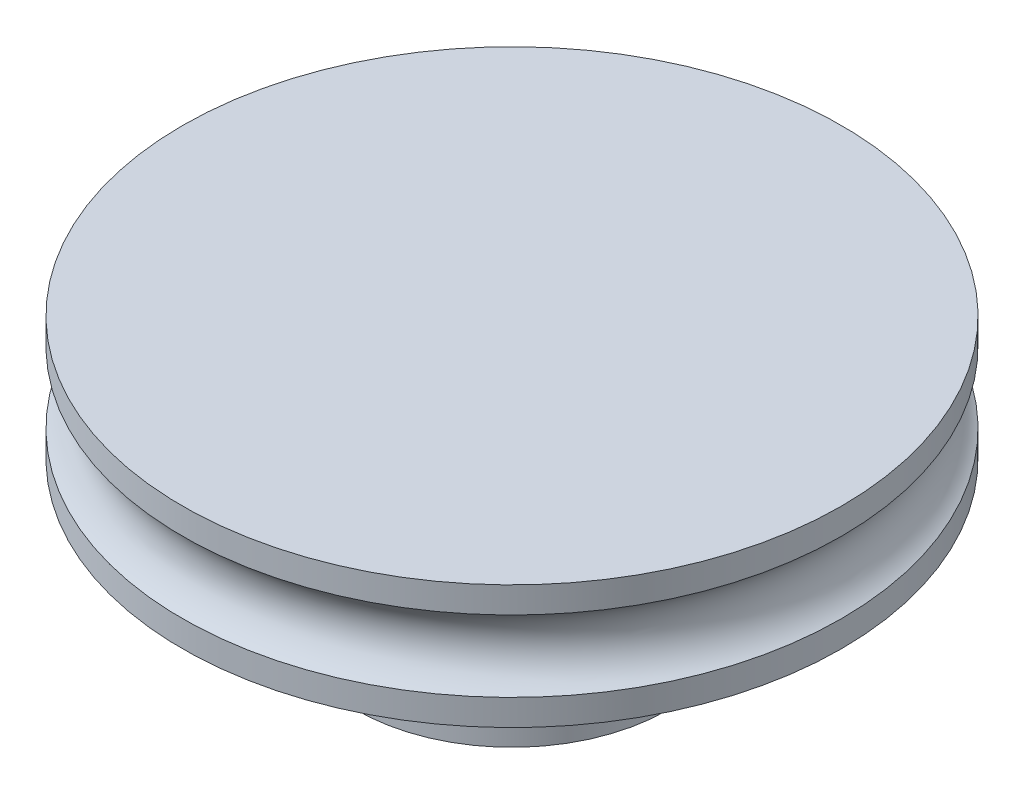
ISO-10303-21;
HEADER;
FILE_DESCRIPTION(('STEP AP214'),'2;1');
FILE_NAME('part.step','',(''),(''),'','','');
FILE_SCHEMA(('AUTOMOTIVE_DESIGN { 1 0 10303 214 1 1 1 1 }'));
ENDSEC;
DATA;
#1=APPLICATION_CONTEXT('core data for automotive mechanical design processes');
#2=APPLICATION_PROTOCOL_DEFINITION('international standard','automotive_design',2000,#1);
#3=PRODUCT_CONTEXT('',#1,'mechanical');
#4=PRODUCT('Part','Part','',(#3));
#5=PRODUCT_RELATED_PRODUCT_CATEGORY('part','',(#4));
#6=PRODUCT_DEFINITION_FORMATION('','',#4);
#7=PRODUCT_DEFINITION_CONTEXT('part definition',#1,'design');
#8=PRODUCT_DEFINITION('design','',#6,#7);
#9=PRODUCT_DEFINITION_SHAPE('','',#8);
#10=(LENGTH_UNIT() NAMED_UNIT(*) SI_UNIT(.MILLI.,.METRE.));
#11=(NAMED_UNIT(*) PLANE_ANGLE_UNIT() SI_UNIT($,.RADIAN.));
#12=(NAMED_UNIT(*) SI_UNIT($,.STERADIAN.) SOLID_ANGLE_UNIT());
#13=UNCERTAINTY_MEASURE_WITH_UNIT(LENGTH_MEASURE(1.E-05),#10,'distance_accuracy_value','');
#14=(GEOMETRIC_REPRESENTATION_CONTEXT(3) GLOBAL_UNCERTAINTY_ASSIGNED_CONTEXT((#13)) GLOBAL_UNIT_ASSIGNED_CONTEXT((#10,
#11,#12)) REPRESENTATION_CONTEXT('',''));
#15=CARTESIAN_POINT('',(0.,0.,0.));
#16=DIRECTION('',(0.,0.,1.));
#17=DIRECTION('',(1.,0.,0.));
#18=AXIS2_PLACEMENT_3D('',#15,#16,#17);
#19=CARTESIAN_POINT('',(0.,2.38125,0.));
#20=DIRECTION('',(0.,1.,0.));
#21=DIRECTION('',(-1.,0.,0.));
#22=AXIS2_PLACEMENT_3D('',#19,#20,#21);
#23=PLANE('',#22);
#24=CARTESIAN_POINT('',(0.,2.38125,0.));
#25=DIRECTION('',(0.,-1.,0.));
#26=DIRECTION('',(1.,0.,0.));
#27=AXIS2_PLACEMENT_3D('',#24,#25,#26);
#28=CIRCLE('',#27,12.7);
#29=CARTESIAN_POINT('',(12.7,2.38125,0.));
#30=VERTEX_POINT('',#29);
#31=EDGE_CURVE('E44',#30,#30,#28,.T.);
#32=ORIENTED_EDGE('',*,*,#31,.F.);
#33=EDGE_LOOP('',(#32));
#34=FACE_BOUND('',#33,.T.);
#35=ADVANCED_FACE('F37',(#34),#23,.T.);
#36=CARTESIAN_POINT('',(0.,0.,0.));
#37=DIRECTION('',(0.,-1.,0.));
#38=DIRECTION('',(1.,0.,0.));
#39=AXIS2_PLACEMENT_3D('',#36,#37,#38);
#40=CYLINDRICAL_SURFACE('',#39,12.7);
#41=ORIENTED_EDGE('',*,*,#31,.T.);
#42=EDGE_LOOP('',(#41));
#43=FACE_BOUND('',#42,.T.);
#44=CARTESIAN_POINT('',(0.,1.3748153285078,0.));
#45=DIRECTION('',(0.,-1.,0.));
#46=DIRECTION('',(1.,0.,0.));
#47=AXIS2_PLACEMENT_3D('',#44,#45,#46);
#48=CIRCLE('',#47,12.7);
#49=CARTESIAN_POINT('',(12.7,1.3748153285078,0.));
#50=VERTEX_POINT('',#49);
#51=EDGE_CURVE('E48',#50,#50,#48,.T.);
#52=ORIENTED_EDGE('',*,*,#51,.F.);
#53=EDGE_LOOP('',(#52));
#54=FACE_BOUND('',#53,.T.);
#55=ADVANCED_FACE('F121',(#43,#54),#40,.T.);
#56=CARTESIAN_POINT('',(0.,0.,0.));
#57=DIRECTION('',(0.,-1.,0.));
#58=DIRECTION('',(1.,0.,0.));
#59=AXIS2_PLACEMENT_3D('',#56,#57,#58);
#60=TOROIDAL_SURFACE('',#59,13.49375,1.5875);
#61=ORIENTED_EDGE('',*,*,#51,.T.);
#62=EDGE_LOOP('',(#61));
#63=FACE_BOUND('',#62,.T.);
#64=CARTESIAN_POINT('',(0.,-1.3748153285078,0.));
#65=DIRECTION('',(0.,-1.,0.));
#66=DIRECTION('',(1.,0.,0.));
#67=AXIS2_PLACEMENT_3D('',#64,#65,#66);
#68=CIRCLE('',#67,12.7);
#69=CARTESIAN_POINT('',(12.7,-1.3748153285078,0.));
#70=VERTEX_POINT('',#69);
#71=EDGE_CURVE('E52',#70,#70,#68,.T.);
#72=ORIENTED_EDGE('',*,*,#71,.F.);
#73=EDGE_LOOP('',(#72));
#74=FACE_BOUND('',#73,.T.);
#75=ADVANCED_FACE('F126',(#63,#74),#60,.F.);
#76=CARTESIAN_POINT('',(0.,0.,0.));
#77=DIRECTION('',(0.,-1.,0.));
#78=DIRECTION('',(1.,0.,0.));
#79=AXIS2_PLACEMENT_3D('',#76,#77,#78);
#80=CYLINDRICAL_SURFACE('',#79,12.7);
#81=ORIENTED_EDGE('',*,*,#71,.T.);
#82=EDGE_LOOP('',(#81));
#83=FACE_BOUND('',#82,.T.);
#84=CARTESIAN_POINT('',(0.,-2.38125,0.));
#85=DIRECTION('',(0.,-1.,0.));
#86=DIRECTION('',(1.,0.,0.));
#87=AXIS2_PLACEMENT_3D('',#84,#85,#86);
#88=CIRCLE('',#87,12.7);
#89=CARTESIAN_POINT('',(12.7,-2.38125,0.));
#90=VERTEX_POINT('',#89);
#91=EDGE_CURVE('E57',#90,#90,#88,.T.);
#92=ORIENTED_EDGE('',*,*,#91,.F.);
#93=EDGE_LOOP('',(#92));
#94=FACE_BOUND('',#93,.T.);
#95=ADVANCED_FACE('F131',(#83,#94),#80,.T.);
#96=CARTESIAN_POINT('',(0.,-2.38125,0.));
#97=DIRECTION('',(0.,-1.,0.));
#98=DIRECTION('',(1.,0.,0.));
#99=AXIS2_PLACEMENT_3D('',#96,#97,#98);
#100=PLANE('',#99);
#101=CARTESIAN_POINT('',(0.,-2.38125,0.));
#102=DIRECTION('',(0.,-1.,0.));
#103=DIRECTION('',(1.,0.,0.));
#104=AXIS2_PLACEMENT_3D('',#101,#102,#103);
#105=CIRCLE('',#104,7.1874076642539);
#106=CARTESIAN_POINT('',(7.1874076642539,-2.38125,0.));
#107=VERTEX_POINT('',#106);
#108=EDGE_CURVE('E10',#107,#107,#105,.F.);
#109=ORIENTED_EDGE('',*,*,#108,.T.);
#110=EDGE_LOOP('',(#109));
#111=FACE_BOUND('',#110,.T.);
#112=ORIENTED_EDGE('',*,*,#91,.T.);
#113=EDGE_LOOP('',(#112));
#114=FACE_BOUND('',#113,.T.);
#115=ADVANCED_FACE('F112',(#111,#114),#100,.T.);
#116=CARTESIAN_POINT('',(0.,-2.778125,0.));
#117=DIRECTION('',(0.,-1.,0.));
#118=DIRECTION('',(1.,0.,0.));
#119=AXIS2_PLACEMENT_3D('',#116,#117,#118);
#120=PLANE('',#119);
#121=CARTESIAN_POINT('',(0.,-2.778125,0.));
#122=DIRECTION('',(0.,-1.,0.));
#123=DIRECTION('',(1.,0.,0.));
#124=AXIS2_PLACEMENT_3D('',#121,#122,#123);
#125=CIRCLE('',#124,6.);
#126=CARTESIAN_POINT('',(6.,-2.778125,0.));
#127=VERTEX_POINT('',#126);
#128=EDGE_CURVE('E64',#127,#127,#125,.T.);
#129=ORIENTED_EDGE('',*,*,#128,.F.);
#130=EDGE_LOOP('',(#129));
#131=FACE_BOUND('',#130,.T.);
#132=CARTESIAN_POINT('',(0.,-2.778125,0.));
#133=DIRECTION('',(0.,-1.,0.));
#134=DIRECTION('',(1.,0.,0.));
#135=AXIS2_PLACEMENT_3D('',#132,#133,#134);
#136=CIRCLE('',#135,6.5);
#137=CARTESIAN_POINT('',(6.5,-2.778125,0.));
#138=VERTEX_POINT('',#137);
#139=EDGE_CURVE('E60',#138,#138,#136,.T.);
#140=ORIENTED_EDGE('',*,*,#139,.T.);
#141=EDGE_LOOP('',(#140));
#142=FACE_BOUND('',#141,.T.);
#143=ADVANCED_FACE('F109',(#131,#142),#120,.T.);
#144=CARTESIAN_POINT('',(0.,-3.175,0.));
#145=DIRECTION('',(0.,-1.,0.));
#146=DIRECTION('',(1.,0.,0.));
#147=AXIS2_PLACEMENT_3D('',#144,#145,#146);
#148=TOROIDAL_SURFACE('',#147,7.1874076642539,0.79375);
#149=ORIENTED_EDGE('',*,*,#108,.F.);
#150=EDGE_LOOP('',(#149));
#151=FACE_BOUND('',#150,.T.);
#152=ORIENTED_EDGE('',*,*,#139,.F.);
#153=EDGE_LOOP('',(#152));
#154=FACE_BOUND('',#153,.T.);
#155=ADVANCED_FACE('F39',(#151,#154),#148,.F.);
#156=CARTESIAN_POINT('',(0.,-7.778125,0.));
#157=DIRECTION('',(0.,1.,0.));
#158=DIRECTION('',(-1.,0.,0.));
#159=AXIS2_PLACEMENT_3D('',#156,#157,#158);
#160=CYLINDRICAL_SURFACE('',#159,6.);
#161=CARTESIAN_POINT('',(0.,-7.778125,0.));
#162=DIRECTION('',(0.,-1.,0.));
#163=DIRECTION('',(1.,0.,0.));
#164=AXIS2_PLACEMENT_3D('',#161,#162,#163);
#165=CIRCLE('',#164,6.);
#166=CARTESIAN_POINT('',(6.,-7.778125,0.));
#167=VERTEX_POINT('',#166);
#168=EDGE_CURVE('E63',#167,#167,#165,.T.);
#169=ORIENTED_EDGE('',*,*,#168,.F.);
#170=EDGE_LOOP('',(#169));
#171=FACE_BOUND('',#170,.T.);
#172=ORIENTED_EDGE('',*,*,#128,.T.);
#173=EDGE_LOOP('',(#172));
#174=FACE_BOUND('',#173,.T.);
#175=ADVANCED_FACE('F98',(#171,#174),#160,.T.);
#176=CARTESIAN_POINT('',(0.,-7.778125,0.));
#177=DIRECTION('',(0.,-1.,0.));
#178=DIRECTION('',(1.,0.,0.));
#179=AXIS2_PLACEMENT_3D('',#176,#177,#178);
#180=PLANE('',#179);
#181=CARTESIAN_POINT('',(-1.7145,-7.778125,0.));
#182=DIRECTION('',(0.,-1.,0.));
#183=DIRECTION('',(1.,0.,0.));
#184=AXIS2_PLACEMENT_3D('',#181,#182,#183);
#185=CIRCLE('',#184,1.651);
#186=CARTESIAN_POINT('',(-0.0634999999999987,-7.778125,0.));
#187=VERTEX_POINT('',#186);
#188=EDGE_CURVE('E78',#187,#187,#185,.T.);
#189=ORIENTED_EDGE('',*,*,#188,.F.);
#190=EDGE_LOOP('',(#189));
#191=FACE_BOUND('',#190,.T.);
#192=CARTESIAN_POINT('',(1.7145,-7.778125,0.));
#193=DIRECTION('',(0.,-1.,0.));
#194=DIRECTION('',(1.,0.,0.));
#195=AXIS2_PLACEMENT_3D('',#192,#193,#194);
#196=CIRCLE('',#195,1.651);
#197=CARTESIAN_POINT('',(3.3655,-7.778125,0.));
#198=VERTEX_POINT('',#197);
#199=EDGE_CURVE('E70',#198,#198,#196,.T.);
#200=ORIENTED_EDGE('',*,*,#199,.F.);
#201=EDGE_LOOP('',(#200));
#202=FACE_BOUND('',#201,.T.);
#203=ORIENTED_EDGE('',*,*,#168,.T.);
#204=EDGE_LOOP('',(#203));
#205=FACE_BOUND('',#204,.T.);
#206=ADVANCED_FACE('F94',(#191,#202,#205),#180,.T.);
#207=CARTESIAN_POINT('',(1.7145,1.111875,0.));
#208=DIRECTION('',(0.,-1.,0.));
#209=DIRECTION('',(1.,0.,0.));
#210=AXIS2_PLACEMENT_3D('',#207,#208,#209);
#211=CYLINDRICAL_SURFACE('',#210,1.651);
#212=CARTESIAN_POINT('',(1.7145,1.111875,0.));
#213=DIRECTION('',(0.,-1.,0.));
#214=DIRECTION('',(1.,0.,0.));
#215=AXIS2_PLACEMENT_3D('',#212,#213,#214);
#216=CIRCLE('',#215,1.651);
#217=CARTESIAN_POINT('',(3.3655,1.111875,0.));
#218=VERTEX_POINT('',#217);
#219=EDGE_CURVE('E74',#218,#218,#216,.T.);
#220=ORIENTED_EDGE('',*,*,#219,.F.);
#221=EDGE_LOOP('',(#220));
#222=FACE_BOUND('',#221,.T.);
#223=ORIENTED_EDGE('',*,*,#199,.T.);
#224=EDGE_LOOP('',(#223));
#225=FACE_BOUND('',#224,.T.);
#226=ADVANCED_FACE('F97',(#222,#225),#211,.F.);
#227=CARTESIAN_POINT('',(1.7145,1.111875,0.));
#228=DIRECTION('',(0.,-1.,0.));
#229=DIRECTION('',(1.,0.,0.));
#230=AXIS2_PLACEMENT_3D('',#227,#228,#229);
#231=PLANE('',#230);
#232=ORIENTED_EDGE('',*,*,#219,.T.);
#233=EDGE_LOOP('',(#232));
#234=FACE_BOUND('',#233,.T.);
#235=ADVANCED_FACE('F90',(#234),#231,.T.);
#236=CARTESIAN_POINT('',(-1.7145,1.111875,0.));
#237=DIRECTION('',(0.,-1.,0.));
#238=DIRECTION('',(1.,0.,0.));
#239=AXIS2_PLACEMENT_3D('',#236,#237,#238);
#240=CYLINDRICAL_SURFACE('',#239,1.651);
#241=CARTESIAN_POINT('',(-1.7145,1.111875,0.));
#242=DIRECTION('',(0.,-1.,0.));
#243=DIRECTION('',(1.,0.,0.));
#244=AXIS2_PLACEMENT_3D('',#241,#242,#243);
#245=CIRCLE('',#244,1.651);
#246=CARTESIAN_POINT('',(-0.0635000000000004,1.111875,0.));
#247=VERTEX_POINT('',#246);
#248=EDGE_CURVE('E67',#247,#247,#245,.T.);
#249=ORIENTED_EDGE('',*,*,#248,.F.);
#250=EDGE_LOOP('',(#249));
#251=FACE_BOUND('',#250,.T.);
#252=ORIENTED_EDGE('',*,*,#188,.T.);
#253=EDGE_LOOP('',(#252));
#254=FACE_BOUND('',#253,.T.);
#255=ADVANCED_FACE('F87',(#251,#254),#240,.F.);
#256=CARTESIAN_POINT('',(-1.7145,1.111875,0.));
#257=DIRECTION('',(0.,-1.,0.));
#258=DIRECTION('',(1.,0.,0.));
#259=AXIS2_PLACEMENT_3D('',#256,#257,#258);
#260=PLANE('',#259);
#261=ORIENTED_EDGE('',*,*,#248,.T.);
#262=EDGE_LOOP('',(#261));
#263=FACE_BOUND('',#262,.T.);
#264=ADVANCED_FACE('F85',(#263),#260,.T.);
#265=CLOSED_SHELL('',(#35,#55,#75,#95,#115,#143,#155,#175,#206,#226,#235,#255,#264));
#266=MANIFOLD_SOLID_BREP('B2',#265);
#267=ADVANCED_BREP_SHAPE_REPRESENTATION('',(#18,#266),#14);
#268=SHAPE_DEFINITION_REPRESENTATION(#9,#267);
ENDSEC;
END-ISO-10303-21;
